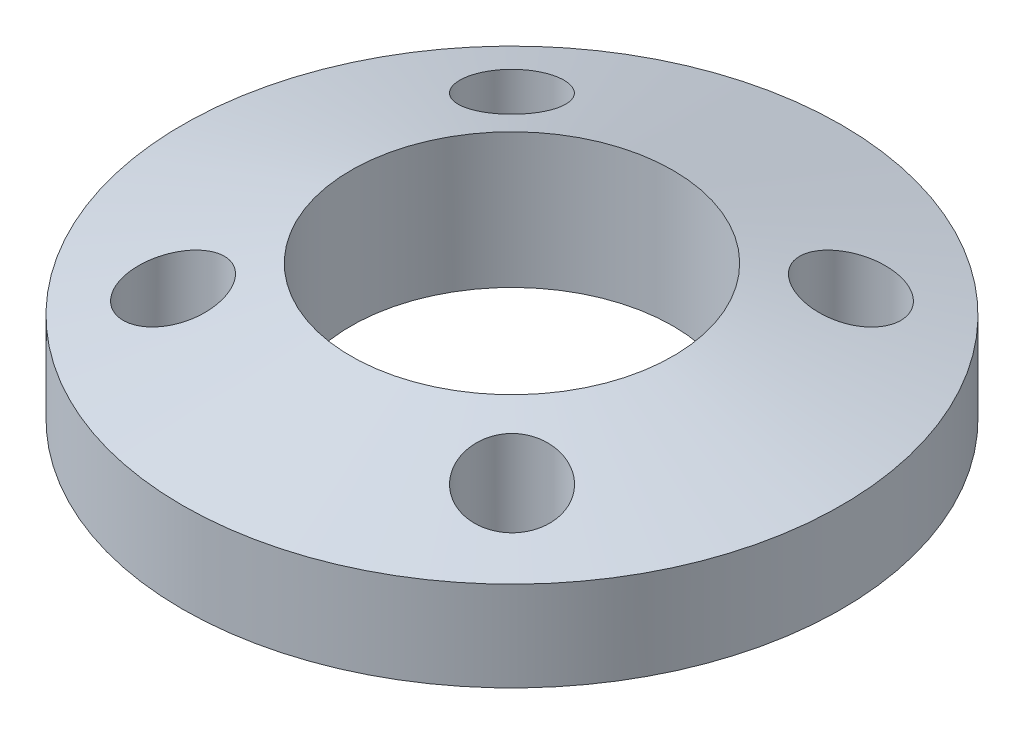
ISO-10303-21;
HEADER;
FILE_DESCRIPTION(('STEP AP214'),'2;1');
FILE_NAME('part.step','',(''),(''),'','','');
FILE_SCHEMA(('AUTOMOTIVE_DESIGN { 1 0 10303 214 1 1 1 1 }'));
ENDSEC;
DATA;
#1=APPLICATION_CONTEXT('core data for automotive mechanical design processes');
#2=APPLICATION_PROTOCOL_DEFINITION('international standard','automotive_design',2000,#1);
#3=PRODUCT_CONTEXT('',#1,'mechanical');
#4=PRODUCT('Part','Part','',(#3));
#5=PRODUCT_RELATED_PRODUCT_CATEGORY('part','',(#4));
#6=PRODUCT_DEFINITION_FORMATION('','',#4);
#7=PRODUCT_DEFINITION_CONTEXT('part definition',#1,'design');
#8=PRODUCT_DEFINITION('design','',#6,#7);
#9=PRODUCT_DEFINITION_SHAPE('','',#8);
#10=(LENGTH_UNIT() NAMED_UNIT(*) SI_UNIT(.MILLI.,.METRE.));
#11=(NAMED_UNIT(*) PLANE_ANGLE_UNIT() SI_UNIT($,.RADIAN.));
#12=(NAMED_UNIT(*) SI_UNIT($,.STERADIAN.) SOLID_ANGLE_UNIT());
#13=UNCERTAINTY_MEASURE_WITH_UNIT(LENGTH_MEASURE(1.E-05),#10,'distance_accuracy_value','');
#14=(GEOMETRIC_REPRESENTATION_CONTEXT(3) GLOBAL_UNCERTAINTY_ASSIGNED_CONTEXT((#13)) GLOBAL_UNIT_ASSIGNED_CONTEXT((#10,
#11,#12)) REPRESENTATION_CONTEXT('',''));
#15=CARTESIAN_POINT('',(0.,0.,0.));
#16=DIRECTION('',(0.,0.,1.));
#17=DIRECTION('',(1.,0.,0.));
#18=AXIS2_PLACEMENT_3D('',#15,#16,#17);
#19=CARTESIAN_POINT('',(0.,0.,0.));
#20=DIRECTION('',(0.,1.,0.));
#21=DIRECTION('',(0.,0.,1.));
#22=AXIS2_PLACEMENT_3D('',#19,#20,#21);
#23=PLANE('',#22);
#24=CARTESIAN_POINT('',(0.,0.,0.));
#25=DIRECTION('',(0.,1.,0.));
#26=DIRECTION('',(0.,0.,1.));
#27=AXIS2_PLACEMENT_3D('',#24,#25,#26);
#28=CIRCLE('',#27,11.);
#29=CARTESIAN_POINT('',(0.,0.,11.));
#30=VERTEX_POINT('',#29);
#31=EDGE_CURVE('E56',#30,#30,#28,.T.);
#32=ORIENTED_EDGE('',*,*,#31,.F.);
#33=EDGE_LOOP('',(#32));
#34=FACE_BOUND('',#33,.T.);
#35=CARTESIAN_POINT('',(0.,0.,0.));
#36=DIRECTION('',(0.,1.,0.));
#37=DIRECTION('',(0.,0.,1.));
#38=AXIS2_PLACEMENT_3D('',#35,#36,#37);
#39=CIRCLE('',#38,5.375);
#40=CARTESIAN_POINT('',(0.,0.,5.375));
#41=VERTEX_POINT('',#40);
#42=EDGE_CURVE('E61',#41,#41,#39,.T.);
#43=ORIENTED_EDGE('',*,*,#42,.T.);
#44=EDGE_LOOP('',(#43));
#45=FACE_BOUND('',#44,.T.);
#46=CARTESIAN_POINT('',(-5.65770862800566,0.,5.65599974191923));
#47=DIRECTION('',(0.,1.,0.));
#48=DIRECTION('',(0.,0.,1.));
#49=AXIS2_PLACEMENT_3D('',#46,#47,#48);
#50=CIRCLE('',#49,1.475);
#51=CARTESIAN_POINT('',(-5.65770862800566,0.,7.13099974191922));
#52=VERTEX_POINT('',#51);
#53=EDGE_CURVE('E134',#52,#52,#50,.T.);
#54=ORIENTED_EDGE('',*,*,#53,.T.);
#55=EDGE_LOOP('',(#54));
#56=FACE_BOUND('',#55,.T.);
#57=CARTESIAN_POINT('',(-5.65770862800566,0.,-5.65599974191923));
#58=DIRECTION('',(0.,1.,0.));
#59=DIRECTION('',(0.,0.,1.));
#60=AXIS2_PLACEMENT_3D('',#57,#58,#59);
#61=CIRCLE('',#60,1.475);
#62=CARTESIAN_POINT('',(-5.65770862800566,0.,-4.18099974191923));
#63=VERTEX_POINT('',#62);
#64=EDGE_CURVE('E150',#63,#63,#61,.T.);
#65=ORIENTED_EDGE('',*,*,#64,.T.);
#66=EDGE_LOOP('',(#65));
#67=FACE_BOUND('',#66,.T.);
#68=CARTESIAN_POINT('',(5.65770862800566,0.,-5.65599974191923));
#69=DIRECTION('',(0.,1.,0.));
#70=DIRECTION('',(0.,0.,1.));
#71=AXIS2_PLACEMENT_3D('',#68,#69,#70);
#72=CIRCLE('',#71,1.475);
#73=CARTESIAN_POINT('',(5.65770862800566,0.,-4.18099974191923));
#74=VERTEX_POINT('',#73);
#75=EDGE_CURVE('E145',#74,#74,#72,.T.);
#76=ORIENTED_EDGE('',*,*,#75,.T.);
#77=EDGE_LOOP('',(#76));
#78=FACE_BOUND('',#77,.T.);
#79=CARTESIAN_POINT('',(5.65770862800566,0.,5.65599974191923));
#80=DIRECTION('',(0.,1.,0.));
#81=DIRECTION('',(0.,0.,1.));
#82=AXIS2_PLACEMENT_3D('',#79,#80,#81);
#83=CIRCLE('',#82,1.475);
#84=CARTESIAN_POINT('',(5.65770862800566,0.,7.13099974191922));
#85=VERTEX_POINT('',#84);
#86=EDGE_CURVE('E142',#85,#85,#83,.T.);
#87=ORIENTED_EDGE('',*,*,#86,.T.);
#88=EDGE_LOOP('',(#87));
#89=FACE_BOUND('',#88,.T.);
#90=ADVANCED_FACE('F43',(#34,#45,#56,#67,#78,#89),#23,.F.);
#91=CARTESIAN_POINT('',(0.,3.,0.));
#92=DIRECTION('',(0.,-1.,0.));
#93=DIRECTION('',(0.,0.,-1.));
#94=AXIS2_PLACEMENT_3D('',#91,#92,#93);
#95=CYLINDRICAL_SURFACE('',#94,11.);
#96=CARTESIAN_POINT('',(0.,3.,0.));
#97=DIRECTION('',(0.,1.,0.));
#98=DIRECTION('',(0.,0.,1.));
#99=AXIS2_PLACEMENT_3D('',#96,#97,#98);
#100=CIRCLE('',#99,11.);
#101=CARTESIAN_POINT('',(0.,3.,11.));
#102=VERTEX_POINT('',#101);
#103=EDGE_CURVE('E10',#102,#102,#100,.T.);
#104=ORIENTED_EDGE('',*,*,#103,.F.);
#105=EDGE_LOOP('',(#104));
#106=FACE_BOUND('',#105,.T.);
#107=ORIENTED_EDGE('',*,*,#31,.T.);
#108=EDGE_LOOP('',(#107));
#109=FACE_BOUND('',#108,.T.);
#110=ADVANCED_FACE('F45',(#106,#109),#95,.T.);
#111=CARTESIAN_POINT('',(0.,3.,0.));
#112=DIRECTION('',(0.,-1.,0.));
#113=DIRECTION('',(0.,0.,-1.));
#114=AXIS2_PLACEMENT_3D('',#111,#112,#113);
#115=CYLINDRICAL_SURFACE('',#114,5.375);
#116=ORIENTED_EDGE('',*,*,#42,.F.);
#117=EDGE_LOOP('',(#116));
#118=FACE_BOUND('',#117,.T.);
#119=CARTESIAN_POINT('',(0.,4.5,0.));
#120=DIRECTION('',(0.,-1.,0.));
#121=DIRECTION('',(0.,0.,-1.));
#122=AXIS2_PLACEMENT_3D('',#119,#120,#121);
#123=CIRCLE('',#122,5.375);
#124=CARTESIAN_POINT('',(0.,4.5,-5.375));
#125=VERTEX_POINT('',#124);
#126=EDGE_CURVE('E93',#125,#125,#123,.T.);
#127=ORIENTED_EDGE('',*,*,#126,.F.);
#128=EDGE_LOOP('',(#127));
#129=FACE_BOUND('',#128,.T.);
#130=ADVANCED_FACE('F119',(#118,#129),#115,.F.);
#131=CARTESIAN_POINT('',(-5.65770862800566,3.,5.65599974191923));
#132=DIRECTION('',(0.,-1.,0.));
#133=DIRECTION('',(0.,0.,-1.));
#134=AXIS2_PLACEMENT_3D('',#131,#132,#133);
#135=CYLINDRICAL_SURFACE('',#134,1.475);
#136=ORIENTED_EDGE('',*,*,#53,.F.);
#137=EDGE_LOOP('',(#136));
#138=FACE_BOUND('',#137,.T.);
#139=CARTESIAN_POINT('',(-6.76645315803553,3.73891797165423,4.6832147877136));
#140=CARTESIAN_POINT('',(-6.70991213357447,3.76109524472025,4.61877701046324));
#141=CARTESIAN_POINT('',(-6.64777250554573,3.78372581878172,4.55931321014649));
#142=CARTESIAN_POINT('',(-6.51413354241729,3.8292920879657,4.45203871712057));
#143=CARTESIAN_POINT('',(-6.44262143598124,3.85222816035175,4.40424418457762));
#144=CARTESIAN_POINT('',(-6.29232439345914,3.8977255270046,4.32174705622212));
#145=CARTESIAN_POINT('',(-6.2135423182673,3.92028696460917,4.28703933757403));
#146=CARTESIAN_POINT('',(-6.05089273849444,3.96431662965879,4.2317782305723));
#147=CARTESIAN_POINT('',(-5.96702668422018,3.98578516569064,4.21122082604083));
#148=CARTESIAN_POINT('',(-5.79703018870177,4.02673053652903,4.18509301834032));
#149=CARTESIAN_POINT('',(-5.71091559647943,4.04621814404216,4.17943686399748));
#150=CARTESIAN_POINT('',(-5.53844703989294,4.08251264507031,4.18330224002252));
#151=CARTESIAN_POINT('',(-5.45209310248635,4.09931982892206,4.19282212533006));
#152=CARTESIAN_POINT('',(-5.28451922012429,4.12893365131756,4.22651553185146));
#153=CARTESIAN_POINT('',(-5.2032233475671,4.1418505827324,4.2502130676769));
#154=CARTESIAN_POINT('',(-5.04543397836769,4.16367755569395,4.31141857612211));
#155=CARTESIAN_POINT('',(-4.96893892297452,4.17258890364307,4.3489220387338));
#156=CARTESIAN_POINT('',(-4.82656598220931,4.18556113629375,4.4347615946418));
#157=CARTESIAN_POINT('',(-4.7603642810403,4.18982327681084,4.48253065424047));
#158=CARTESIAN_POINT('',(-4.63667678676569,4.19394402808271,4.58841264958295));
#159=CARTESIAN_POINT('',(-4.57918918248408,4.19380355516043,4.64652343038441));
#160=CARTESIAN_POINT('',(-4.47619105019358,4.18919873895588,4.76949659231572));
#161=CARTESIAN_POINT('',(-4.43038023940264,4.18486055561629,4.83411278682286));
#162=CARTESIAN_POINT('',(-4.34980326274285,4.17229284383385,4.96954661158989));
#163=CARTESIAN_POINT('',(-4.3150373531212,4.16406322511878,5.0403643856809));
#164=CARTESIAN_POINT('',(-4.25707360944502,4.1440580894708,5.18684429442599));
#165=CARTESIAN_POINT('',(-4.23398170818067,4.13225160368366,5.26254399999598));
#166=CARTESIAN_POINT('',(-4.20021500891818,4.10568713466898,5.41615602297434));
#167=CARTESIAN_POINT('',(-4.18954228728868,4.09092865837996,5.49406870814182));
#168=CARTESIAN_POINT('',(-4.18047950733743,4.05846193420665,5.65314409513122));
#169=CARTESIAN_POINT('',(-4.18258072566939,4.04066164024326,5.73431589348326));
#170=CARTESIAN_POINT('',(-4.19993174983948,4.00323722164556,5.89481061532112));
#171=CARTESIAN_POINT('',(-4.2151843110452,3.98361271558521,5.97413314778605));
#172=CARTESIAN_POINT('',(-4.25919658451257,3.9423439222049,6.13223634415076));
#173=CARTESIAN_POINT('',(-4.28849866672593,3.92064936221304,6.21085315834132));
#174=CARTESIAN_POINT('',(-4.35988714131947,3.876679297437,6.3618775642266));
#175=CARTESIAN_POINT('',(-4.40197547258785,3.85440370501454,6.43428421208395));
#176=CARTESIAN_POINT('',(-4.4989604944109,3.80934885018786,6.57264423746937));
#177=CARTESIAN_POINT('',(-4.55414593454324,3.78657063019697,6.63839585388362));
#178=CARTESIAN_POINT('',(-4.67520310034386,3.74166973605572,6.75946541273384));
#179=CARTESIAN_POINT('',(-4.7410752083935,3.7195470853959,6.81478298167429));
#180=CARTESIAN_POINT('',(-4.88172489932996,3.67650208319349,6.91331815359405));
#181=CARTESIAN_POINT('',(-4.95650646381157,3.6555802745371,6.95653031759554));
#182=CARTESIAN_POINT('',(-5.11284220701819,3.61545528467664,7.02938260563148));
#183=CARTESIAN_POINT('',(-5.19439584069861,3.5962519654193,7.05902382066459));
#184=CARTESIAN_POINT('',(-5.36034647954515,3.56035623145459,7.10321708617397));
#185=CARTESIAN_POINT('',(-5.44466349605217,3.54362409911565,7.1180368852139));
#186=CARTESIAN_POINT('',(-5.61504290285383,3.51264539351054,7.13285898306572));
#187=CARTESIAN_POINT('',(-5.70110503367018,3.49839845370646,7.13286346882027));
#188=CARTESIAN_POINT('',(-5.87002526852939,3.47307070568298,7.11803310779571));
#189=CARTESIAN_POINT('',(-5.95290722968025,3.46191494411337,7.10359801499914));
#190=CARTESIAN_POINT('',(-6.11532638346367,3.44252714307123,7.06072815653576));
#191=CARTESIAN_POINT('',(-6.19486408203746,3.43429465993336,7.03229551683813));
#192=CARTESIAN_POINT('',(-6.34621685011727,3.42111060628436,6.96303266637034));
#193=CARTESIAN_POINT('',(-6.41817524437413,3.41608218117086,6.92253005493448));
#194=CARTESIAN_POINT('',(-6.55442834156495,3.40909775839452,6.83000901438251));
#195=CARTESIAN_POINT('',(-6.61872382281923,3.40714144845146,6.77799175634252));
#196=CARTESIAN_POINT('',(-6.73682946387126,3.40635090940859,6.66481661534531));
#197=CARTESIAN_POINT('',(-6.7907844733406,3.40746955901858,6.60381009991458));
#198=CARTESIAN_POINT('',(-6.8878845546363,3.41270352030231,6.47384537032848));
#199=CARTESIAN_POINT('',(-6.93102992994463,3.41681874783406,6.40488737949126));
#200=CARTESIAN_POINT('',(-7.0052928380955,3.42794748291089,6.26112625127921));
#201=CARTESIAN_POINT('',(-7.03642831816938,3.4349566331542,6.18633203807401));
#202=CARTESIAN_POINT('',(-7.08600513553857,3.45172192772531,6.03294913624094));
#203=CARTESIAN_POINT('',(-7.10444646806293,3.46147807308553,5.95436044618697));
#204=CARTESIAN_POINT('',(-7.12842690315128,3.48366628271249,5.79461817963545));
#205=CARTESIAN_POINT('',(-7.13380656128282,3.49612941185691,5.71344504319111));
#206=CARTESIAN_POINT('',(-7.13123839092878,3.52340031702535,5.55168808776424));
#207=CARTESIAN_POINT('',(-7.12328598480909,3.53820889679113,5.47110448074203));
#208=CARTESIAN_POINT('',(-7.09412739958387,3.57022537156949,5.31087422076286));
#209=CARTESIAN_POINT('',(-7.07261911648403,3.58748081342125,5.23129227869589));
#210=CARTESIAN_POINT('',(-7.01687686770634,3.6237378850188,5.0772196730872));
#211=CARTESIAN_POINT('',(-6.98265605437051,3.64273769480528,5.00272384144125));
#212=CARTESIAN_POINT('',(-6.9176131543745,3.67470003056453,4.88731812418363));
#213=CARTESIAN_POINT('',(-6.89031059514205,3.68726141718521,4.84427124468873));
#214=CARTESIAN_POINT('',(-6.83147800969291,3.71280149829446,4.76130597852026));
#215=CARTESIAN_POINT('',(-6.79994795855698,3.72578019524257,4.72138761029012));
#216=CARTESIAN_POINT('',(-6.76645315803553,3.73891797165423,4.6832147877136));
#217=B_SPLINE_CURVE_WITH_KNOTS('',3,(#139,#140,#141,#142,#143,#144,#145,#146,#147,#148,#149,
#150,#151,#152,#153,#154,#155,#156,#157,#158,#159,#160,#161,#162,#163,#164,#165,#166,#167,#168,
#169,#170,#171,#172,#173,#174,#175,#176,#177,#178,#179,#180,#181,#182,#183,#184,#185,#186,#187,
#188,#189,#190,#191,#192,#193,#194,#195,#196,#197,#198,#199,#200,#201,#202,#203,#204,#205,#206,
#207,#208,#209,#210,#211,#212,#213,#214,#215,#216),.UNSPECIFIED.,.T.,.F.,(4,2,2,2,2,2,2,2,2,2,2,
2,2,2,2,2,2,2,2,2,2,2,2,2,2,2,2,2,2,2,2,2,2,2,2,2,2,2,4),(0.,0.265455452396761,
0.531276461347859,0.796993306324719,1.06263470374531,1.32674406004088,1.59082478921775,
1.84650129811764,2.10209435870168,2.3461206390274,2.59009613011262,2.82695974922292,
3.06382886328599,3.3028104486822,3.541831983787,3.79010279814149,4.03842564091833,
4.29721816825115,4.55604995811072,4.82122814427571,5.08641582091682,5.35172245640334,
5.61700775955475,5.87740909802016,6.13777199768819,6.39112097315235,6.64443148144586,
6.89141124967623,7.1383659108112,7.38155737433398,7.62474200945793,7.86756181561904,
8.1103817130411,8.35615114437015,8.6020049792051,8.85354157333436,9.10481865003315,
9.26207305243024,9.41932838181475),.UNSPECIFIED.);
#218=CARTESIAN_POINT('',(-6.76645315803553,3.73891797165423,4.6832147877136));
#219=VERTEX_POINT('',#218);
#220=EDGE_CURVE('E66',#219,#219,#217,.T.);
#221=ORIENTED_EDGE('',*,*,#220,.F.);
#222=EDGE_LOOP('',(#221));
#223=FACE_BOUND('',#222,.T.);
#224=ADVANCED_FACE('F110',(#138,#223),#135,.F.);
#225=CARTESIAN_POINT('',(-5.65770862800566,3.,-5.65599974191923));
#226=DIRECTION('',(0.,-1.,0.));
#227=DIRECTION('',(0.,0.,-1.));
#228=AXIS2_PLACEMENT_3D('',#225,#226,#227);
#229=CYLINDRICAL_SURFACE('',#228,1.475);
#230=ORIENTED_EDGE('',*,*,#64,.F.);
#231=EDGE_LOOP('',(#230));
#232=FACE_BOUND('',#231,.T.);
#233=CARTESIAN_POINT('',(-6.70069188377059,3.40666667041888,-6.69898149065433));
#234=CARTESIAN_POINT('',(-6.64320188167068,3.40667011220806,-6.7564661676125));
#235=CARTESIAN_POINT('',(-6.58090444462083,3.40818985667057,-6.80922752727318));
#236=CARTESIAN_POINT('',(-6.44851430755091,3.41423503459538,-6.90375069432471));
#237=CARTESIAN_POINT('',(-6.37841230223988,3.41876408867084,-6.94549916706903));
#238=CARTESIAN_POINT('',(-6.23256237989773,3.43072548535487,-7.01678916264551));
#239=CARTESIAN_POINT('',(-6.1568198191287,3.43815510134004,-7.04634209617335));
#240=CARTESIAN_POINT('',(-6.0018343807856,3.45575528113238,-7.09257292511713));
#241=CARTESIAN_POINT('',(-5.92259224957126,3.46592526283458,-7.10925355194776));
#242=CARTESIAN_POINT('',(-5.76202670653258,3.48890435706268,-7.1295514807054));
#243=CARTESIAN_POINT('',(-5.68069050158689,3.50173838867943,-7.13303898257168));
#244=CARTESIAN_POINT('',(-5.51894223100494,3.52971249591985,-7.12668741275725));
#245=CARTESIAN_POINT('',(-5.43853028878089,3.54485287573867,-7.11684658178668));
#246=CARTESIAN_POINT('',(-5.2789415984682,3.57750035540813,-7.08391817299652));
#247=CARTESIAN_POINT('',(-5.19983677815361,3.59505421077037,-7.06052859224157));
#248=CARTESIAN_POINT('',(-5.04695225223104,3.63186947541735,-7.00111336219144));
#249=CARTESIAN_POINT('',(-4.97317326116235,3.65113111305691,-6.96508602113785));
#250=CARTESIAN_POINT('',(-4.83096019861738,3.69147946358999,-6.88039446989574));
#251=CARTESIAN_POINT('',(-4.76272219623837,3.71260123988395,-6.8314176587696));
#252=CARTESIAN_POINT('',(-4.6356654105773,3.75571233055654,-6.72278996097979));
#253=CARTESIAN_POINT('',(-4.57684785277009,3.77770175734202,-6.66313768771382));
#254=CARTESIAN_POINT('',(-4.46901956663608,3.82248606427959,-6.53344311265093));
#255=CARTESIAN_POINT('',(-4.42024794008546,3.84528808479543,-6.4632043237075));
#256=CARTESIAN_POINT('',(-4.33550525478834,3.89059878969726,-6.31529435697336));
#257=CARTESIAN_POINT('',(-4.29953528614705,3.91310744894538,-6.23762254694958));
#258=CARTESIAN_POINT('',(-4.2413047600489,3.95726577363595,-6.07648549995665));
#259=CARTESIAN_POINT('',(-4.21912942571059,3.97890934104943,-5.99298772516569));
#260=CARTESIAN_POINT('',(-4.18965201256756,4.02040723499476,-5.82296435885509));
#261=CARTESIAN_POINT('',(-4.18234925377057,4.04026164328948,-5.7364389059486));
#262=CARTESIAN_POINT('',(-4.18308855563305,4.07700732669725,-5.56443887791832));
#263=CARTESIAN_POINT('',(-4.19085730175838,4.09394542692347,-5.47897334934516));
#264=CARTESIAN_POINT('',(-4.22127581398495,4.1244687658835,-5.31011007665902));
#265=CARTESIAN_POINT('',(-4.24392176182588,4.13805486368431,-5.22671180767794));
#266=CARTESIAN_POINT('',(-4.30246417886737,4.16064821755817,-5.06794911529009));
#267=CARTESIAN_POINT('',(-4.33778542283861,4.16981896263866,-4.99239599436551));
#268=CARTESIAN_POINT('',(-4.42087640206089,4.18384131465573,-4.84803912839064));
#269=CARTESIAN_POINT('',(-4.46864233600043,4.18869423850385,-4.77923333114468));
#270=CARTESIAN_POINT('',(-4.57297554878819,4.19367112373384,-4.65331183580853));
#271=CARTESIAN_POINT('',(-4.62908778614657,4.19398552051979,-4.59582600835252));
#272=CARTESIAN_POINT('',(-4.74980953240507,4.19035686671339,-4.49077676205665));
#273=CARTESIAN_POINT('',(-4.81441819194271,4.18641424139939,-4.44321235262918));
#274=CARTESIAN_POINT('',(-4.9493020622543,4.17458222176504,-4.35985559288184));
#275=CARTESIAN_POINT('',(-5.0194913366686,4.16674554607178,-4.32391630954821));
#276=CARTESIAN_POINT('',(-5.16427319347737,4.14756998968958,-4.26377370060222));
#277=CARTESIAN_POINT('',(-5.23886621330536,4.13623076060941,-4.23957154307151));
#278=CARTESIAN_POINT('',(-5.39233928320297,4.11027153390593,-4.20287082398515));
#279=CARTESIAN_POINT('',(-5.47127984913047,4.09557679352919,-4.19067907759461));
#280=CARTESIAN_POINT('',(-5.62959635561289,4.06372119770167,-4.17913208142864));
#281=CARTESIAN_POINT('',(-5.70897238008633,4.04655984960824,-4.17977939947896));
#282=CARTESIAN_POINT('',(-5.86962181568342,4.00963048830246,-4.19398088247192));
#283=CARTESIAN_POINT('',(-5.95082701512734,3.98978143712476,-4.20809667583803));
#284=CARTESIAN_POINT('',(-6.10947209890933,3.94880602074201,-4.24949375903478));
#285=CARTESIAN_POINT('',(-6.1869112531932,3.92767940964651,-4.27677759040203));
#286=CARTESIAN_POINT('',(-6.33876170207695,3.88402317880575,-4.34490784641132));
#287=CARTESIAN_POINT('',(-6.41296325116272,3.8614704361126,-4.38620767849302));
#288=CARTESIAN_POINT('',(-6.55320511124511,3.81634728362826,-4.48089491895543));
#289=CARTESIAN_POINT('',(-6.61924455633289,3.79377687221779,-4.53428360813136));
#290=CARTESIAN_POINT('',(-6.74214548344762,3.74890862402477,-4.65251078569566));
#291=CARTESIAN_POINT('',(-6.79886870828088,3.72661876782553,-4.71749622864658));
#292=CARTESIAN_POINT('',(-6.90028799117665,3.68320033468478,-4.85660617371487));
#293=CARTESIAN_POINT('',(-6.9449842743043,3.66207173601808,-4.93073050477459));
#294=CARTESIAN_POINT('',(-7.0205310698091,3.62167468085612,-5.0853211641012));
#295=CARTESIAN_POINT('',(-7.05150326892134,3.60239111565738,-5.16572400083512));
#296=CARTESIAN_POINT('',(-7.09905810427008,3.56592681608988,-5.33113265151192));
#297=CARTESIAN_POINT('',(-7.11564299277706,3.54874575294546,-5.41613774277767));
#298=CARTESIAN_POINT('',(-7.13347329122063,3.51726981531424,-5.58616164542908));
#299=CARTESIAN_POINT('',(-7.13507295857777,3.50291618469493,-5.6711323775415));
#300=CARTESIAN_POINT('',(-7.12358029602804,3.47692562654966,-5.84052144729583));
#301=CARTESIAN_POINT('',(-7.1104865130865,3.46528896784243,-5.92493972947556));
#302=CARTESIAN_POINT('',(-7.07035986865353,3.44528066545836,-6.08835916574537));
#303=CARTESIAN_POINT('',(-7.04370945137045,3.43682997248779,-6.16744483401685));
#304=CARTESIAN_POINT('',(-6.9773505134978,3.42296240143774,-6.32013857841224));
#305=CARTESIAN_POINT('',(-6.93766014645385,3.41754133384907,-6.39375409608486));
#306=CARTESIAN_POINT('',(-6.86431792245212,3.4113546501797,-6.50587704307627));
#307=CARTESIAN_POINT('',(-6.83440682648897,3.40959697733205,-6.54682678203393));
#308=CARTESIAN_POINT('',(-6.77051746405916,3.40725192148992,-6.62545696471011));
#309=CARTESIAN_POINT('',(-6.73653924685257,3.40666452432283,-6.66313744801559));
#310=CARTESIAN_POINT('',(-6.70069188377059,3.40666667041888,-6.69898149065433));
#311=B_SPLINE_CURVE_WITH_KNOTS('',3,(#233,#234,#235,#236,#237,#238,#239,#240,#241,#242,#243,
#244,#245,#246,#247,#248,#249,#250,#251,#252,#253,#254,#255,#256,#257,#258,#259,#260,#261,#262,
#263,#264,#265,#266,#267,#268,#269,#270,#271,#272,#273,#274,#275,#276,#277,#278,#279,#280,#281,
#282,#283,#284,#285,#286,#287,#288,#289,#290,#291,#292,#293,#294,#295,#296,#297,#298,#299,#300,
#301,#302,#303,#304,#305,#306,#307,#308,#309,#310),.UNSPECIFIED.,.T.,.F.,(4,2,2,2,2,2,2,2,2,2,2,
2,2,2,2,2,2,2,2,2,2,2,2,2,2,2,2,2,2,2,2,2,2,2,2,2,2,2,4),(0.,0.243710887096198,0.48771552412038,
0.731491338936955,0.975215411972892,1.22133121109365,1.4674794997415,1.7193379502003,
1.97123012865745,2.2298685266874,2.48854054286202,2.75279636205469,3.01707467815865,
3.28296989733297,3.54885295918086,3.80995940090313,4.07099885535917,4.32144139873671,
4.57180753231715,4.81163629663927,5.05144110418046,5.28808437689086,5.52475119556772,
5.76731816859203,6.00993365574315,6.26312945175231,6.51637413612919,6.77874685186679,
7.04114737859493,7.30714575742051,7.57313915816223,7.83672443623224,8.10026844373087,
8.35756596307513,8.61488892880232,8.86532491181158,9.11541371771554,9.26737924461585,
9.41934293112934),.UNSPECIFIED.);
#312=CARTESIAN_POINT('',(-6.70069188377059,3.40666667041888,-6.69898149065433));
#313=VERTEX_POINT('',#312);
#314=EDGE_CURVE('E47',#313,#313,#311,.T.);
#315=ORIENTED_EDGE('',*,*,#314,.F.);
#316=EDGE_LOOP('',(#315));
#317=FACE_BOUND('',#316,.T.);
#318=ADVANCED_FACE('F102',(#232,#317),#229,.F.);
#319=CARTESIAN_POINT('',(5.65770862800566,3.,-5.65599974191923));
#320=DIRECTION('',(0.,-1.,0.));
#321=DIRECTION('',(0.,0.,-1.));
#322=AXIS2_PLACEMENT_3D('',#319,#320,#321);
#323=CYLINDRICAL_SURFACE('',#322,1.475);
#324=ORIENTED_EDGE('',*,*,#75,.F.);
#325=EDGE_LOOP('',(#324));
#326=FACE_BOUND('',#325,.T.);
#327=CARTESIAN_POINT('',(4.68494938379514,3.73902439568604,-6.76476682873367));
#328=CARTESIAN_POINT('',(4.74818178958837,3.71726345503869,-6.82023835513912));
#329=CARTESIAN_POINT('',(4.81629182720583,3.69590742961677,-6.87039906295742));
#330=CARTESIAN_POINT('',(4.9604346690573,3.65452765605487,-6.95852925688097));
#331=CARTESIAN_POINT('',(5.03647567750596,3.63450532334233,-6.99648594948685));
#332=CARTESIAN_POINT('',(5.19439728067248,3.59626185907911,-7.05891719849528));
#333=CARTESIAN_POINT('',(5.27628110644211,3.57804173764118,-7.08338422888615));
#334=CARTESIAN_POINT('',(5.44347626435747,3.54384395415922,-7.1178520576747));
#335=CARTESIAN_POINT('',(5.52878658343075,3.52786563549357,-7.1278570999937));
#336=CARTESIAN_POINT('',(5.69864004188436,3.49880241430159,-7.13283029303332));
#337=CARTESIAN_POINT('',(5.78316614529031,3.48566756180935,-7.12808530742417));
#338=CARTESIAN_POINT('',(5.95054233674824,3.46220797293502,-7.10410808279219));
#339=CARTESIAN_POINT('',(6.03339261436714,3.45188291704869,-7.08487749187709));
#340=CARTESIAN_POINT('',(6.19269446427838,3.43451802813522,-7.03304171670745));
#341=CARTESIAN_POINT('',(6.26925766544258,3.42739805209198,-7.00080622808136));
#342=CARTESIAN_POINT('',(6.41605901476763,3.41620869545417,-6.92383092067892));
#343=CARTESIAN_POINT('',(6.48629796351125,3.41213892825669,-6.8790926875672));
#344=CARTESIAN_POINT('',(6.61705427927289,3.40719010566968,-6.77934898896363));
#345=CARTESIAN_POINT('',(6.67773221058772,3.40625137405306,-6.72455681032226));
#346=CARTESIAN_POINT('',(6.78919962412509,3.40741753435195,-6.60573031846281));
#347=CARTESIAN_POINT('',(6.83998967659111,3.40952225068985,-6.54169653858785));
#348=CARTESIAN_POINT('',(6.92996632026139,3.41670548102505,-6.40668304367975));
#349=CARTESIAN_POINT('',(6.96922449161566,3.42176504128328,-6.33574997921268));
#350=CARTESIAN_POINT('',(7.03554342532348,3.4347331732077,-6.18864095238007));
#351=CARTESIAN_POINT('',(7.06260396035958,3.44264179796466,-6.11246489233557));
#352=CARTESIAN_POINT('',(7.10406242718603,3.46121225574388,-5.95642215646563));
#353=CARTESIAN_POINT('',(7.11835970210262,3.47189513130491,-5.87653128209815));
#354=CARTESIAN_POINT('',(7.13370199601575,3.49575726710526,-5.71585975104728));
#355=CARTESIAN_POINT('',(7.1347459367775,3.5089367303678,-5.63507902250423));
#356=CARTESIAN_POINT('',(7.12363171257603,3.53780067556116,-5.47323785539115));
#357=CARTESIAN_POINT('',(7.11121306727718,3.55352939059867,-5.39220325534769));
#358=CARTESIAN_POINT('',(7.07330600554089,3.5869643835473,-5.23368052001764));
#359=CARTESIAN_POINT('',(7.04781596374713,3.60467090717384,-5.15619282707495));
#360=CARTESIAN_POINT('',(6.98379863209759,3.64217501444576,-5.00481730327813));
#361=CARTESIAN_POINT('',(6.94494670967991,3.66201528444066,-4.93107734237046));
#362=CARTESIAN_POINT('',(6.85561197569265,3.70294177662033,-4.79140269308187));
#363=CARTESIAN_POINT('',(6.80512756520492,3.72402816979171,-4.72546907959311));
#364=CARTESIAN_POINT('',(6.69260052525235,3.76749636077141,-4.60158113412933));
#365=CARTESIAN_POINT('',(6.63030135327661,3.78989734156531,-4.54386642018428));
#366=CARTESIAN_POINT('',(6.49679464222575,3.83492439942203,-4.43997496221398));
#367=CARTESIAN_POINT('',(6.42558611715005,3.85755050114354,-4.39379949693857));
#368=CARTESIAN_POINT('',(6.27518710405927,3.90270385788461,-4.31372495872923));
#369=CARTESIAN_POINT('',(6.19590058143263,3.92522550642583,-4.2800028442464));
#370=CARTESIAN_POINT('',(6.03237773806808,3.96912528180733,-4.22678993085029));
#371=CARTESIAN_POINT('',(5.94814131396972,3.99050338475107,-4.20729942922596));
#372=CARTESIAN_POINT('',(5.77772735530711,4.03116903650613,-4.18339383067976));
#373=CARTESIAN_POINT('',(5.69156892578113,4.0504709559,-4.17886764982483));
#374=CARTESIAN_POINT('',(5.51921012554363,4.08633397519573,-4.18498820667308));
#375=CARTESIAN_POINT('',(5.43300976444475,4.10289554019679,-4.19563236667718));
#376=CARTESIAN_POINT('',(5.26600386291084,4.13195942761872,-4.23148331449256));
#377=CARTESIAN_POINT('',(5.18511407458349,4.14457664806681,-4.25620318947522));
#378=CARTESIAN_POINT('',(5.02831045369421,4.16576996832564,-4.31935480367911));
#379=CARTESIAN_POINT('',(4.95239501491562,4.17434737818152,-4.35778209069499));
#380=CARTESIAN_POINT('',(4.81130627773212,4.18665136269269,-4.44529489266313));
#381=CARTESIAN_POINT('',(4.7458023469263,4.19057986660204,-4.49381946917156));
#382=CARTESIAN_POINT('',(4.62362366815136,4.19403898376386,-4.60106069186989));
#383=CARTESIAN_POINT('',(4.56694718733673,4.19357046127006,-4.65977533293371));
#384=CARTESIAN_POINT('',(4.46556263394975,4.18834129997824,-4.78384553528509));
#385=CARTESIAN_POINT('',(4.42056417320593,4.18370106396862,-4.84896944907137));
#386=CARTESIAN_POINT('',(4.34167579516895,4.17055923306348,-4.98526627219954));
#387=CARTESIAN_POINT('',(4.30778623895541,4.16205751267715,-5.05643937806742));
#388=CARTESIAN_POINT('',(4.25157379754058,4.14153166766939,-5.20358611108775));
#389=CARTESIAN_POINT('',(4.22937471803759,4.12947187135237,-5.27960192412394));
#390=CARTESIAN_POINT('',(4.19743457885883,4.10244049602223,-5.43369558103053));
#391=CARTESIAN_POINT('',(4.1876951661543,4.08746853236782,-5.51177369611277));
#392=CARTESIAN_POINT('',(4.18054881850113,4.05460185766365,-5.67107833919716));
#393=CARTESIAN_POINT('',(4.18364062301455,4.03661553599056,-5.75230822971458));
#394=CARTESIAN_POINT('',(4.20298389913046,3.99885935699607,-5.91278207096291));
#395=CARTESIAN_POINT('',(4.21924118754901,3.97908871475197,-5.99202512790653));
#396=CARTESIAN_POINT('',(4.26529450965642,3.93756659931152,-6.14980640337606));
#397=CARTESIAN_POINT('',(4.2956336834417,3.91576672405852,-6.22817329838282));
#398=CARTESIAN_POINT('',(4.36904425101529,3.87165043287105,-6.37846168069926));
#399=CARTESIAN_POINT('',(4.41210321100218,3.84933454089591,-6.45038937337893));
#400=CARTESIAN_POINT('',(4.49341402814539,3.81224649206067,-6.56327192971811));
#401=CARTESIAN_POINT('',(4.52847428658192,3.79744225917272,-6.60655225022556));
#402=CARTESIAN_POINT('',(4.60329222675461,3.76804088469933,-6.68892131562883));
#403=CARTESIAN_POINT('',(4.64304998862244,3.75344374665135,-6.72800998900033));
#404=CARTESIAN_POINT('',(4.68494938379514,3.73902439568604,-6.76476682873367));
#405=B_SPLINE_CURVE_WITH_KNOTS('',3,(#327,#328,#329,#330,#331,#332,#333,#334,#335,#336,#337,
#338,#339,#340,#341,#342,#343,#344,#345,#346,#347,#348,#349,#350,#351,#352,#353,#354,#355,#356,
#357,#358,#359,#360,#361,#362,#363,#364,#365,#366,#367,#368,#369,#370,#371,#372,#373,#374,#375,
#376,#377,#378,#379,#380,#381,#382,#383,#384,#385,#386,#387,#388,#389,#390,#391,#392,#393,#394,
#395,#396,#397,#398,#399,#400,#401,#402,#403,#404),.UNSPECIFIED.,.T.,.F.,(4,2,2,2,2,2,2,2,2,2,2,
2,2,2,2,2,2,2,2,2,2,2,2,2,2,2,2,2,2,2,2,2,2,2,2,2,2,2,4),(0.,0.260450051211866,
0.521172249341393,0.782039760067441,1.04283070275177,1.29858164366015,1.55430349075828,
1.8032173706987,2.05209969637034,2.29621046595201,2.54030715325787,2.78285502600527,
3.02540741873372,3.26985620972461,3.5143248878999,3.76360948292052,4.01292508262984,
4.26878455688645,4.52467922074814,4.78694689816181,5.04924362652887,5.31513585777012,
5.58103364316492,5.84495311681838,6.10882775140804,6.36408521689318,6.61925984942665,
6.86288834687572,7.10646895913909,7.3432374248791,7.5800135856887,7.81924926301245,
8.05851656024934,8.30716935391289,8.55593206812303,8.81520804138222,9.07423140206669,
9.24680926471729,9.41939007168772),.UNSPECIFIED.);
#406=CARTESIAN_POINT('',(4.68494938379514,3.73902439568604,-6.76476682873367));
#407=VERTEX_POINT('',#406);
#408=EDGE_CURVE('E73',#407,#407,#405,.T.);
#409=ORIENTED_EDGE('',*,*,#408,.F.);
#410=EDGE_LOOP('',(#409));
#411=FACE_BOUND('',#410,.T.);
#412=ADVANCED_FACE('F99',(#326,#411),#323,.F.);
#413=CARTESIAN_POINT('',(5.65770862800566,3.,5.65599974191923));
#414=DIRECTION('',(0.,-1.,0.));
#415=DIRECTION('',(0.,0.,-1.));
#416=AXIS2_PLACEMENT_3D('',#413,#414,#415);
#417=CYLINDRICAL_SURFACE('',#416,1.475);
#418=ORIENTED_EDGE('',*,*,#86,.F.);
#419=EDGE_LOOP('',(#418));
#420=FACE_BOUND('',#419,.T.);
#421=CARTESIAN_POINT('',(4.61472795334434,4.19333268936653,4.6130142371374));
#422=CARTESIAN_POINT('',(4.67131757534327,4.19332668172971,4.55643031574394));
#423=CARTESIAN_POINT('',(4.73256912128684,4.19118267828453,4.50442369688851));
#424=CARTESIAN_POINT('',(4.86255190855114,4.18273119094819,4.41110318686157));
#425=CARTESIAN_POINT('',(4.93129230195123,4.17641856384524,4.36980259245869));
#426=CARTESIAN_POINT('',(5.07405208656616,4.16000064193014,4.299053099349));
#427=CARTESIAN_POINT('',(5.14806239472035,4.14990175068892,4.26958436314277));
#428=CARTESIAN_POINT('',(5.29934873422712,4.12643223995758,4.223006430442));
#429=CARTESIAN_POINT('',(5.37662435156577,4.11306203421919,4.20589567200674));
#430=CARTESIAN_POINT('',(5.53428262875993,4.08330137805258,4.18396846486938));
#431=CARTESIAN_POINT('',(5.61469532631432,4.06684606212876,4.17945738139773));
#432=CARTESIAN_POINT('',(5.77472791819936,4.03181470546695,4.18347053410204));
#433=CARTESIAN_POINT('',(5.85434763383899,4.01323819799028,4.19199764428516));
#434=CARTESIAN_POINT('',(6.0142740146727,3.9737706626925,4.22233432842486));
#435=CARTESIAN_POINT('',(6.09445693890857,3.95281377915894,4.24471147110971));
#436=CARTESIAN_POINT('',(6.24973228211912,3.91000053741323,4.30248634804881));
#437=CARTESIAN_POINT('',(6.32482378672589,3.88814401876233,4.33788641379284));
#438=CARTESIAN_POINT('',(6.47013442963691,3.84350418895988,4.42196404636551));
#439=CARTESIAN_POINT('',(6.54013842317976,3.82071280237642,4.47100973030341));
#440=CARTESIAN_POINT('',(6.67071746400626,3.77548432744165,4.5805003384787));
#441=CARTESIAN_POINT('',(6.73129190845648,3.7530472618245,4.64094599097308));
#442=CARTESIAN_POINT('',(6.84158519536225,3.70896176365182,4.77200759676893));
#443=CARTESIAN_POINT('',(6.89123253598288,3.68731925529618,4.84268579626278));
#444=CARTESIAN_POINT('',(6.97759192339849,3.64550980325656,4.99194722865537));
#445=CARTESIAN_POINT('',(7.01430465342201,3.62534278167941,5.07053004373669));
#446=CARTESIAN_POINT('',(7.0730762050771,3.58724883571206,5.23215315300717));
#447=CARTESIAN_POINT('',(7.09534032851724,3.5692936044015,5.31511202437585));
#448=CARTESIAN_POINT('',(7.12516566744956,3.53570692267064,5.48409177520152));
#449=CARTESIAN_POINT('',(7.13272890374204,3.52007515313756,5.57011223215392));
#450=CARTESIAN_POINT('',(7.13268879190433,3.49187292440148,5.74036855675167));
#451=CARTESIAN_POINT('',(7.12547224800473,3.47923380603042,5.82459311090059));
#452=CARTESIAN_POINT('',(7.0966541707034,3.45679862687374,5.99093576083245));
#453=CARTESIAN_POINT('',(7.07505487776418,3.44700212362296,6.07305418262789));
#454=CARTESIAN_POINT('',(7.01871755371158,3.43069758620109,6.23053363347771));
#455=CARTESIAN_POINT('',(6.9843407706056,3.42410969399071,6.30601571088533));
#456=CARTESIAN_POINT('',(6.90331981170603,3.4139926014587,6.45030516060705));
#457=CARTESIAN_POINT('',(6.85667708979676,3.41046303884543,6.51911332265952));
#458=CARTESIAN_POINT('',(6.7534078154268,3.40657806964809,6.64680164219669));
#459=CARTESIAN_POINT('',(6.69697869163183,3.40616599138377,6.70583987078917));
#460=CARTESIAN_POINT('',(6.57519690838786,3.40837542452051,6.81378204073827));
#461=CARTESIAN_POINT('',(6.50984469593186,3.41099678401374,6.86268648942747));
#462=CARTESIAN_POINT('',(6.37247260639124,3.41919389919859,6.94877781931697));
#463=CARTESIAN_POINT('',(6.30048860786512,3.42475444871526,6.98602345365659));
#464=CARTESIAN_POINT('',(6.1516390699847,3.43870027668163,7.04817907494456));
#465=CARTESIAN_POINT('',(6.07477341464634,3.4470856222665,7.07308876867754));
#466=CARTESIAN_POINT('',(5.9176300554476,3.46659052992319,7.11018050158158));
#467=CARTESIAN_POINT('',(5.83732791405791,3.47773396373415,7.12224626485294));
#468=CARTESIAN_POINT('',(5.67621170729678,3.50247952184953,7.13309273875986));
#469=CARTESIAN_POINT('',(5.59539759810534,3.51608185943505,7.13187229642847));
#470=CARTESIAN_POINT('',(5.43379770744614,3.54576512339577,7.11620955788667));
#471=CARTESIAN_POINT('',(5.35304651034651,3.56189116831644,7.10149656295327));
#472=CARTESIAN_POINT('',(5.19546433792646,3.59606714645059,7.05907353830034));
#473=CARTESIAN_POINT('',(5.11863385532686,3.61411732059552,7.03136187946148));
#474=CARTESIAN_POINT('',(4.96892927986945,3.65225868156492,6.96296473357967));
#475=CARTESIAN_POINT('',(4.89621378132409,3.67239125188901,6.92195519335153));
#476=CARTESIAN_POINT('',(4.7589322633692,3.71382712924007,6.82848631473138));
#477=CARTESIAN_POINT('',(4.6943673841792,3.73513059947142,6.77602537715745));
#478=CARTESIAN_POINT('',(4.57360079805604,3.77893890380591,6.65975759458895));
#479=CARTESIAN_POINT('',(4.51764099885247,3.80146035956345,6.5957055953763));
#480=CARTESIAN_POINT('',(4.41753825727283,3.84662446575929,6.45898349486894));
#481=CARTESIAN_POINT('',(4.37339656258509,3.86926712873676,6.38631248479581));
#482=CARTESIAN_POINT('',(4.29771256012531,3.91430274892225,6.23340851389134));
#483=CARTESIAN_POINT('',(4.26633151434787,3.93668923203534,6.15309369952484));
#484=CARTESIAN_POINT('',(4.21796214412435,3.98018515321987,5.98790468389603));
#485=CARTESIAN_POINT('',(4.20097343424917,4.00129462547581,5.9030306047963));
#486=CARTESIAN_POINT('',(4.18217908656592,4.0412354855407,5.73196148483168));
#487=CARTESIAN_POINT('',(4.18022749550708,4.0600870192825,5.64578729825329));
#488=CARTESIAN_POINT('',(4.19147063343984,4.09492041308116,5.47381234066068));
#489=CARTESIAN_POINT('',(4.20466642446866,4.11090207182994,5.38801159625325));
#490=CARTESIAN_POINT('',(4.24540153359149,4.13868288664513,5.22235992357795));
#491=CARTESIAN_POINT('',(4.27243734473094,4.15060588930682,5.14240588300812));
#492=CARTESIAN_POINT('',(4.33998037111182,4.17031907731505,4.98794494348799));
#493=CARTESIAN_POINT('',(4.38046539426371,4.17811601634496,4.91342931622496));
#494=CARTESIAN_POINT('',(4.45435693319492,4.18683619857312,4.80158336727402));
#495=CARTESIAN_POINT('',(4.48373349698911,4.18926912158454,4.76164994934971));
#496=CARTESIAN_POINT('',(4.54638607852116,4.19251920740844,4.68489663733494));
#497=CARTESIAN_POINT('',(4.57966199535865,4.19333641201979,4.64807666272289));
#498=CARTESIAN_POINT('',(4.61472795334434,4.19333268936653,4.6130142371374));
#499=B_SPLINE_CURVE_WITH_KNOTS('',3,(#421,#422,#423,#424,#425,#426,#427,#428,#429,#430,#431,
#432,#433,#434,#435,#436,#437,#438,#439,#440,#441,#442,#443,#444,#445,#446,#447,#448,#449,#450,
#451,#452,#453,#454,#455,#456,#457,#458,#459,#460,#461,#462,#463,#464,#465,#466,#467,#468,#469,
#470,#471,#472,#473,#474,#475,#476,#477,#478,#479,#480,#481,#482,#483,#484,#485,#486,#487,#488,
#489,#490,#491,#492,#493,#494,#495,#496,#497,#498),.UNSPECIFIED.,.T.,.F.,(4,2,2,2,2,2,2,2,2,2,2,
2,2,2,2,2,2,2,2,2,2,2,2,2,2,2,2,2,2,2,2,2,2,2,2,2,2,2,4),(0.,0.23989069720252,0.480077923845052,
0.719860749711036,0.95961326381075,1.20512799072859,1.45069684422486,1.70706384571207,
1.96347676685569,2.22762007522578,2.49178026341498,2.75762073748131,3.02344716728757,
3.28540856928957,3.54733395923856,3.80249208868822,4.05761048035697,4.30600569148108,
4.55437147352842,4.7982111942592,5.04203870456689,5.28461692253131,5.5272009061078,
5.77196279366474,6.01674592164393,6.26655014424301,6.5163856831122,6.77283550703651,
7.0293211669887,7.29205186305392,7.5548102858055,7.82079317413986,8.08676893918428,
8.35015979841973,8.61356912606002,8.86801263883964,9.1220383713015,9.27069132992008,
9.41934044281608),.UNSPECIFIED.);
#500=CARTESIAN_POINT('',(4.61472795334434,4.19333268936653,4.6130142371374));
#501=VERTEX_POINT('',#500);
#502=EDGE_CURVE('E85',#501,#501,#499,.T.);
#503=ORIENTED_EDGE('',*,*,#502,.F.);
#504=EDGE_LOOP('',(#503));
#505=FACE_BOUND('',#504,.T.);
#506=ADVANCED_FACE('F101',(#420,#505),#417,.F.);
#507=CARTESIAN_POINT('',(0.,4.5,0.));
#508=DIRECTION('',(0.,-1.,0.));
#509=DIRECTION('',(0.,0.,-1.));
#510=AXIS2_PLACEMENT_3D('',#507,#508,#509);
#511=CONICAL_SURFACE('',#510,5.375,1.31019393504756);
#512=ORIENTED_EDGE('',*,*,#314,.T.);
#513=EDGE_LOOP('',(#512));
#514=FACE_BOUND('',#513,.T.);
#515=ORIENTED_EDGE('',*,*,#502,.T.);
#516=EDGE_LOOP('',(#515));
#517=FACE_BOUND('',#516,.T.);
#518=ORIENTED_EDGE('',*,*,#408,.T.);
#519=EDGE_LOOP('',(#518));
#520=FACE_BOUND('',#519,.T.);
#521=ORIENTED_EDGE('',*,*,#220,.T.);
#522=EDGE_LOOP('',(#521));
#523=FACE_BOUND('',#522,.T.);
#524=ORIENTED_EDGE('',*,*,#103,.T.);
#525=EDGE_LOOP('',(#524));
#526=FACE_BOUND('',#525,.T.);
#527=ORIENTED_EDGE('',*,*,#126,.T.);
#528=EDGE_LOOP('',(#527));
#529=FACE_BOUND('',#528,.T.);
#530=ADVANCED_FACE('F78',(#514,#517,#520,#523,#526,#529),#511,.T.);
#531=CLOSED_SHELL('',(#90,#110,#130,#224,#318,#412,#506,#530));
#532=MANIFOLD_SOLID_BREP('B2',#531);
#533=ADVANCED_BREP_SHAPE_REPRESENTATION('',(#18,#532),#14);
#534=SHAPE_DEFINITION_REPRESENTATION(#9,#533);
ENDSEC;
END-ISO-10303-21;
